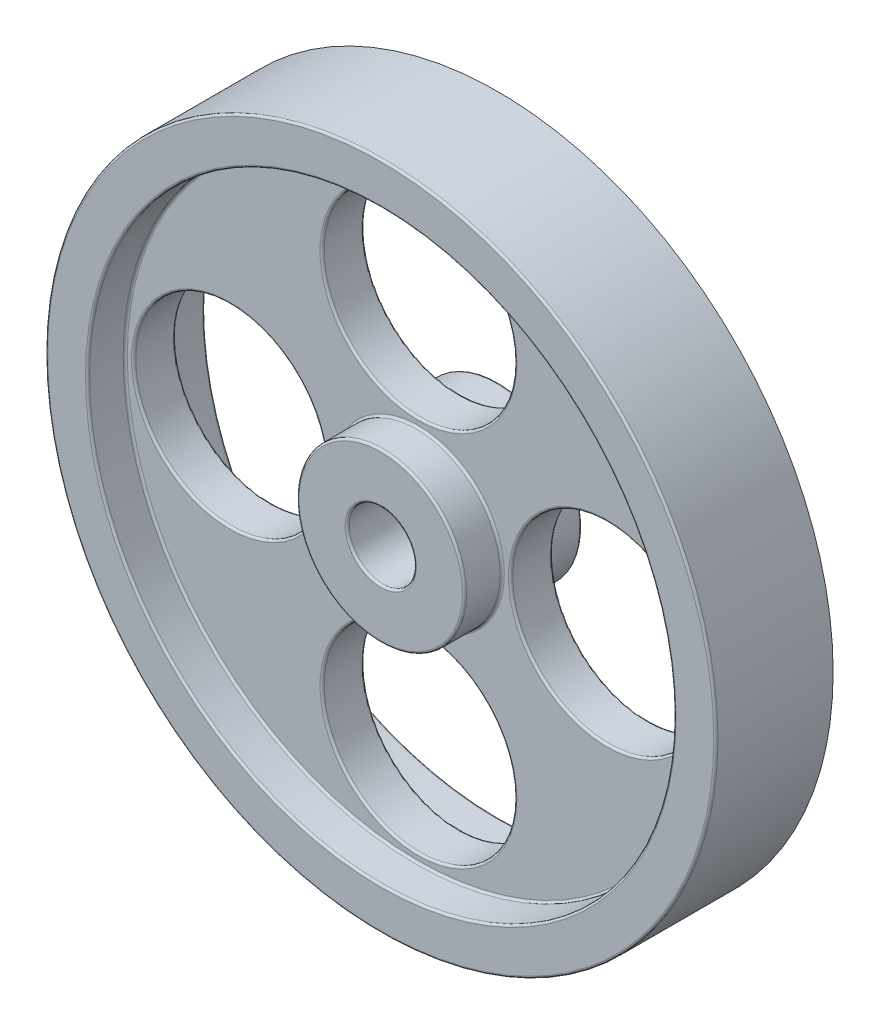
ISO-10303-21;
HEADER;
FILE_DESCRIPTION(('STEP AP214'),'2;1');
FILE_NAME('part.step','',(''),(''),'','','');
FILE_SCHEMA(('AUTOMOTIVE_DESIGN { 1 0 10303 214 1 1 1 1 }'));
ENDSEC;
DATA;
#1=APPLICATION_CONTEXT('core data for automotive mechanical design processes');
#2=APPLICATION_PROTOCOL_DEFINITION('international standard','automotive_design',2000,#1);
#3=PRODUCT_CONTEXT('',#1,'mechanical');
#4=PRODUCT('Part','Part','',(#3));
#5=PRODUCT_RELATED_PRODUCT_CATEGORY('part','',(#4));
#6=PRODUCT_DEFINITION_FORMATION('','',#4);
#7=PRODUCT_DEFINITION_CONTEXT('part definition',#1,'design');
#8=PRODUCT_DEFINITION('design','',#6,#7);
#9=PRODUCT_DEFINITION_SHAPE('','',#8);
#10=(LENGTH_UNIT() NAMED_UNIT(*) SI_UNIT(.MILLI.,.METRE.));
#11=(NAMED_UNIT(*) PLANE_ANGLE_UNIT() SI_UNIT($,.RADIAN.));
#12=(NAMED_UNIT(*) SI_UNIT($,.STERADIAN.) SOLID_ANGLE_UNIT());
#13=UNCERTAINTY_MEASURE_WITH_UNIT(LENGTH_MEASURE(1.E-05),#10,'distance_accuracy_value','');
#14=(GEOMETRIC_REPRESENTATION_CONTEXT(3) GLOBAL_UNCERTAINTY_ASSIGNED_CONTEXT((#13)) GLOBAL_UNIT_ASSIGNED_CONTEXT((#10,
#11,#12)) REPRESENTATION_CONTEXT('',''));
#15=CARTESIAN_POINT('',(0.,0.,0.));
#16=DIRECTION('',(0.,0.,1.));
#17=DIRECTION('',(1.,0.,0.));
#18=AXIS2_PLACEMENT_3D('',#15,#16,#17);
#19=CARTESIAN_POINT('',(0.,0.,177.8));
#20=DIRECTION('',(0.,0.,-1.));
#21=DIRECTION('',(-1.,0.,0.));
#22=AXIS2_PLACEMENT_3D('',#19,#20,#21);
#23=CYLINDRICAL_SURFACE('',#22,101.6);
#24=CARTESIAN_POINT('',(0.,0.,-171.45));
#25=DIRECTION('',(0.,0.,-1.));
#26=DIRECTION('',(-1.,0.,0.));
#27=AXIS2_PLACEMENT_3D('',#24,#25,#26);
#28=CIRCLE('',#27,101.6);
#29=CARTESIAN_POINT('',(-101.6,0.,-171.45));
#30=VERTEX_POINT('',#29);
#31=EDGE_CURVE('E83',#30,#30,#28,.T.);
#32=ORIENTED_EDGE('',*,*,#31,.T.);
#33=EDGE_LOOP('',(#32));
#34=FACE_BOUND('',#33,.T.);
#35=CARTESIAN_POINT('',(0.,0.,171.45));
#36=DIRECTION('',(0.,0.,1.));
#37=DIRECTION('',(1.,0.,0.));
#38=AXIS2_PLACEMENT_3D('',#35,#36,#37);
#39=CIRCLE('',#38,101.6);
#40=CARTESIAN_POINT('',(101.6,0.,171.45));
#41=VERTEX_POINT('',#40);
#42=EDGE_CURVE('E86',#41,#41,#39,.T.);
#43=ORIENTED_EDGE('',*,*,#42,.T.);
#44=EDGE_LOOP('',(#43));
#45=FACE_BOUND('',#44,.T.);
#46=ADVANCED_FACE('F30',(#34,#45),#23,.F.);
#47=CARTESIAN_POINT('',(0.,0.,-177.8));
#48=DIRECTION('',(0.,0.,1.));
#49=DIRECTION('',(1.,0.,0.));
#50=AXIS2_PLACEMENT_3D('',#47,#48,#49);
#51=PLANE('',#50);
#52=CARTESIAN_POINT('',(0.,0.,-177.8));
#53=DIRECTION('',(0.,0.,1.));
#54=DIRECTION('',(1.,0.,0.));
#55=AXIS2_PLACEMENT_3D('',#52,#53,#54);
#56=CIRCLE('',#55,895.35);
#57=CARTESIAN_POINT('',(895.35,0.,-177.8));
#58=VERTEX_POINT('',#57);
#59=EDGE_CURVE('E149',#58,#58,#56,.T.);
#60=ORIENTED_EDGE('',*,*,#59,.T.);
#61=EDGE_LOOP('',(#60));
#62=FACE_BOUND('',#61,.T.);
#63=CARTESIAN_POINT('',(0.,0.,-177.8));
#64=DIRECTION('',(0.,0.,1.));
#65=DIRECTION('',(1.,0.,0.));
#66=AXIS2_PLACEMENT_3D('',#63,#64,#65);
#67=CIRCLE('',#66,1016.);
#68=CARTESIAN_POINT('',(1016.,0.,-177.8));
#69=VERTEX_POINT('',#68);
#70=EDGE_CURVE('E152',#69,#69,#67,.T.);
#71=ORIENTED_EDGE('',*,*,#70,.F.);
#72=EDGE_LOOP('',(#71));
#73=FACE_BOUND('',#72,.T.);
#74=ADVANCED_FACE('F158',(#62,#73),#51,.F.);
#75=CARTESIAN_POINT('',(0.,571.5,-177.8));
#76=DIRECTION('',(0.,0.,1.));
#77=DIRECTION('',(1.,0.,0.));
#78=AXIS2_PLACEMENT_3D('',#75,#76,#77);
#79=CYLINDRICAL_SURFACE('',#78,292.1);
#80=CARTESIAN_POINT('',(0.,571.5,-57.15));
#81=DIRECTION('',(0.,0.,-1.));
#82=DIRECTION('',(-1.,0.,0.));
#83=AXIS2_PLACEMENT_3D('',#80,#81,#82);
#84=CIRCLE('',#83,292.1);
#85=CARTESIAN_POINT('',(-292.1,571.5,-57.15));
#86=VERTEX_POINT('',#85);
#87=EDGE_CURVE('E119',#86,#86,#84,.T.);
#88=ORIENTED_EDGE('',*,*,#87,.T.);
#89=EDGE_LOOP('',(#88));
#90=FACE_BOUND('',#89,.T.);
#91=CARTESIAN_POINT('',(0.,571.5,57.15));
#92=DIRECTION('',(0.,0.,1.));
#93=DIRECTION('',(1.,0.,0.));
#94=AXIS2_PLACEMENT_3D('',#91,#92,#93);
#95=CIRCLE('',#94,292.1);
#96=CARTESIAN_POINT('',(292.1,571.5,57.15));
#97=VERTEX_POINT('',#96);
#98=EDGE_CURVE('E122',#97,#97,#95,.T.);
#99=ORIENTED_EDGE('',*,*,#98,.T.);
#100=EDGE_LOOP('',(#99));
#101=FACE_BOUND('',#100,.T.);
#102=ADVANCED_FACE('F160',(#90,#101),#79,.F.);
#103=CARTESIAN_POINT('',(-571.499999999984,-1.62080126571903E-11,-177.8));
#104=DIRECTION('',(0.,0.,1.));
#105=DIRECTION('',(1.,0.,0.));
#106=AXIS2_PLACEMENT_3D('',#103,#104,#105);
#107=CYLINDRICAL_SURFACE('',#106,292.100000000026);
#108=CARTESIAN_POINT('',(-571.499999999984,-1.62080126571903E-11,-57.15));
#109=DIRECTION('',(0.,0.,-1.));
#110=DIRECTION('',(-1.,0.,0.));
#111=AXIS2_PLACEMENT_3D('',#108,#109,#110);
#112=CIRCLE('',#111,292.100000000026);
#113=CARTESIAN_POINT('',(-863.60000000001,-1.62080126571903E-11,-57.15));
#114=VERTEX_POINT('',#113);
#115=EDGE_CURVE('E113',#114,#114,#112,.T.);
#116=ORIENTED_EDGE('',*,*,#115,.T.);
#117=EDGE_LOOP('',(#116));
#118=FACE_BOUND('',#117,.T.);
#119=CARTESIAN_POINT('',(-571.499999999984,-1.62080126571903E-11,57.15));
#120=DIRECTION('',(0.,0.,1.));
#121=DIRECTION('',(1.,0.,0.));
#122=AXIS2_PLACEMENT_3D('',#119,#120,#121);
#123=CIRCLE('',#122,292.100000000026);
#124=CARTESIAN_POINT('',(-279.399999999958,-1.62080126571903E-11,57.15));
#125=VERTEX_POINT('',#124);
#126=EDGE_CURVE('E116',#125,#125,#123,.T.);
#127=ORIENTED_EDGE('',*,*,#126,.T.);
#128=EDGE_LOOP('',(#127));
#129=FACE_BOUND('',#128,.T.);
#130=ADVANCED_FACE('F167',(#118,#129),#107,.F.);
#131=CARTESIAN_POINT('',(571.500000000016,1.6138024092619E-11,-177.8));
#132=DIRECTION('',(0.,0.,1.));
#133=DIRECTION('',(1.,0.,0.));
#134=AXIS2_PLACEMENT_3D('',#131,#132,#133);
#135=CYLINDRICAL_SURFACE('',#134,292.100000000013);
#136=CARTESIAN_POINT('',(571.500000000016,1.6138024092619E-11,-57.15));
#137=DIRECTION('',(0.,0.,-1.));
#138=DIRECTION('',(-1.,0.,0.));
#139=AXIS2_PLACEMENT_3D('',#136,#137,#138);
#140=CIRCLE('',#139,292.100000000013);
#141=CARTESIAN_POINT('',(279.400000000004,1.6138024092619E-11,-57.15));
#142=VERTEX_POINT('',#141);
#143=EDGE_CURVE('E107',#142,#142,#140,.T.);
#144=ORIENTED_EDGE('',*,*,#143,.T.);
#145=EDGE_LOOP('',(#144));
#146=FACE_BOUND('',#145,.T.);
#147=CARTESIAN_POINT('',(571.500000000016,1.6138024092619E-11,57.15));
#148=DIRECTION('',(0.,0.,1.));
#149=DIRECTION('',(1.,0.,0.));
#150=AXIS2_PLACEMENT_3D('',#147,#148,#149);
#151=CIRCLE('',#150,292.100000000013);
#152=CARTESIAN_POINT('',(863.600000000029,1.6138024092619E-11,57.15));
#153=VERTEX_POINT('',#152);
#154=EDGE_CURVE('E110',#153,#153,#151,.T.);
#155=ORIENTED_EDGE('',*,*,#154,.T.);
#156=EDGE_LOOP('',(#155));
#157=FACE_BOUND('',#156,.T.);
#158=ADVANCED_FACE('F258',(#146,#157),#135,.F.);
#159=CARTESIAN_POINT('',(3.2276048185238E-11,-571.5,-177.8));
#160=DIRECTION('',(0.,0.,1.));
#161=DIRECTION('',(1.,0.,0.));
#162=AXIS2_PLACEMENT_3D('',#159,#160,#161);
#163=CYLINDRICAL_SURFACE('',#162,292.100000000035);
#164=CARTESIAN_POINT('',(3.2276048185238E-11,-571.5,-57.15));
#165=DIRECTION('',(0.,0.,-1.));
#166=DIRECTION('',(-1.,0.,0.));
#167=AXIS2_PLACEMENT_3D('',#164,#165,#166);
#168=CIRCLE('',#167,292.100000000035);
#169=CARTESIAN_POINT('',(-292.100000000002,-571.5,-57.15));
#170=VERTEX_POINT('',#169);
#171=EDGE_CURVE('E101',#170,#170,#168,.T.);
#172=ORIENTED_EDGE('',*,*,#171,.T.);
#173=EDGE_LOOP('',(#172));
#174=FACE_BOUND('',#173,.T.);
#175=CARTESIAN_POINT('',(3.2276048185238E-11,-571.5,57.15));
#176=DIRECTION('',(0.,0.,1.));
#177=DIRECTION('',(1.,0.,0.));
#178=AXIS2_PLACEMENT_3D('',#175,#176,#177);
#179=CIRCLE('',#178,292.100000000035);
#180=CARTESIAN_POINT('',(292.100000000067,-571.5,57.15));
#181=VERTEX_POINT('',#180);
#182=EDGE_CURVE('E104',#181,#181,#179,.T.);
#183=ORIENTED_EDGE('',*,*,#182,.T.);
#184=EDGE_LOOP('',(#183));
#185=FACE_BOUND('',#184,.T.);
#186=ADVANCED_FACE('F260',(#174,#185),#163,.F.);
#187=CARTESIAN_POINT('',(0.,0.,63.5));
#188=DIRECTION('',(0.,0.,1.));
#189=DIRECTION('',(1.,0.,0.));
#190=AXIS2_PLACEMENT_3D('',#187,#188,#189);
#191=PLANE('',#190);
#192=CARTESIAN_POINT('',(0.,0.,63.5));
#193=DIRECTION('',(0.,0.,1.));
#194=DIRECTION('',(1.,0.,0.));
#195=AXIS2_PLACEMENT_3D('',#192,#193,#194);
#196=CIRCLE('',#195,260.35);
#197=CARTESIAN_POINT('',(260.35,0.,63.5));
#198=VERTEX_POINT('',#197);
#199=EDGE_CURVE('E10',#198,#198,#196,.F.);
#200=ORIENTED_EDGE('',*,*,#199,.T.);
#201=EDGE_LOOP('',(#200));
#202=FACE_BOUND('',#201,.T.);
#203=CARTESIAN_POINT('',(0.,0.,63.5));
#204=DIRECTION('',(0.,0.,1.));
#205=DIRECTION('',(1.,0.,0.));
#206=AXIS2_PLACEMENT_3D('',#203,#204,#205);
#207=CIRCLE('',#206,882.65);
#208=CARTESIAN_POINT('',(882.65,0.,63.5));
#209=VERTEX_POINT('',#208);
#210=EDGE_CURVE('E37',#209,#209,#207,.T.);
#211=ORIENTED_EDGE('',*,*,#210,.T.);
#212=EDGE_LOOP('',(#211));
#213=FACE_BOUND('',#212,.T.);
#214=CARTESIAN_POINT('',(0.,571.5,63.5));
#215=DIRECTION('',(0.,0.,1.));
#216=DIRECTION('',(1.,0.,0.));
#217=AXIS2_PLACEMENT_3D('',#214,#215,#216);
#218=CIRCLE('',#217,298.45);
#219=CARTESIAN_POINT('',(298.45,571.5,63.5));
#220=VERTEX_POINT('',#219);
#221=EDGE_CURVE('E41',#220,#220,#218,.F.);
#222=ORIENTED_EDGE('',*,*,#221,.T.);
#223=EDGE_LOOP('',(#222));
#224=FACE_BOUND('',#223,.T.);
#225=CARTESIAN_POINT('',(-571.499999999984,-1.62080126571903E-11,63.5));
#226=DIRECTION('',(0.,0.,1.));
#227=DIRECTION('',(1.,0.,0.));
#228=AXIS2_PLACEMENT_3D('',#225,#226,#227);
#229=CIRCLE('',#228,298.450000000026);
#230=CARTESIAN_POINT('',(-273.049999999958,-1.62080126571903E-11,63.5));
#231=VERTEX_POINT('',#230);
#232=EDGE_CURVE('E45',#231,#231,#229,.F.);
#233=ORIENTED_EDGE('',*,*,#232,.T.);
#234=EDGE_LOOP('',(#233));
#235=FACE_BOUND('',#234,.T.);
#236=CARTESIAN_POINT('',(571.500000000016,1.6138024092619E-11,63.5));
#237=DIRECTION('',(0.,0.,1.));
#238=DIRECTION('',(1.,0.,0.));
#239=AXIS2_PLACEMENT_3D('',#236,#237,#238);
#240=CIRCLE('',#239,298.450000000013);
#241=CARTESIAN_POINT('',(869.950000000029,1.6138024092619E-11,63.5));
#242=VERTEX_POINT('',#241);
#243=EDGE_CURVE('E50',#242,#242,#240,.F.);
#244=ORIENTED_EDGE('',*,*,#243,.T.);
#245=EDGE_LOOP('',(#244));
#246=FACE_BOUND('',#245,.T.);
#247=CARTESIAN_POINT('',(3.2276048185238E-11,-571.5,63.5));
#248=DIRECTION('',(0.,0.,1.));
#249=DIRECTION('',(1.,0.,0.));
#250=AXIS2_PLACEMENT_3D('',#247,#248,#249);
#251=CIRCLE('',#250,298.450000000035);
#252=CARTESIAN_POINT('',(298.450000000067,-571.5,63.5));
#253=VERTEX_POINT('',#252);
#254=EDGE_CURVE('E53',#253,#253,#251,.F.);
#255=ORIENTED_EDGE('',*,*,#254,.T.);
#256=EDGE_LOOP('',(#255));
#257=FACE_BOUND('',#256,.T.);
#258=ADVANCED_FACE('F267',(#202,#213,#224,#235,#246,#257),#191,.T.);
#259=CARTESIAN_POINT('',(0.,0.,177.8));
#260=DIRECTION('',(0.,0.,1.));
#261=DIRECTION('',(1.,0.,0.));
#262=AXIS2_PLACEMENT_3D('',#259,#260,#261);
#263=PLANE('',#262);
#264=CARTESIAN_POINT('',(0.,0.,177.8));
#265=DIRECTION('',(0.,0.,1.));
#266=DIRECTION('',(1.,0.,0.));
#267=AXIS2_PLACEMENT_3D('',#264,#265,#266);
#268=CIRCLE('',#267,1009.65);
#269=CARTESIAN_POINT('',(1009.65,0.,177.8));
#270=VERTEX_POINT('',#269);
#271=EDGE_CURVE('E65',#270,#270,#268,.T.);
#272=ORIENTED_EDGE('',*,*,#271,.T.);
#273=EDGE_LOOP('',(#272));
#274=FACE_BOUND('',#273,.T.);
#275=CARTESIAN_POINT('',(0.,0.,177.8));
#276=DIRECTION('',(0.,0.,1.));
#277=DIRECTION('',(1.,0.,0.));
#278=AXIS2_PLACEMENT_3D('',#275,#276,#277);
#279=CIRCLE('',#278,895.35);
#280=CARTESIAN_POINT('',(895.35,0.,177.8));
#281=VERTEX_POINT('',#280);
#282=EDGE_CURVE('E68',#281,#281,#279,.F.);
#283=ORIENTED_EDGE('',*,*,#282,.T.);
#284=EDGE_LOOP('',(#283));
#285=FACE_BOUND('',#284,.T.);
#286=ADVANCED_FACE('F174',(#274,#285),#263,.T.);
#287=CARTESIAN_POINT('',(0.,0.,177.8));
#288=DIRECTION('',(0.,0.,-1.));
#289=DIRECTION('',(-1.,0.,0.));
#290=AXIS2_PLACEMENT_3D('',#287,#288,#289);
#291=CYLINDRICAL_SURFACE('',#290,1016.);
#292=CARTESIAN_POINT('',(0.,0.,171.45));
#293=DIRECTION('',(0.,0.,1.));
#294=DIRECTION('',(1.,0.,0.));
#295=AXIS2_PLACEMENT_3D('',#292,#293,#294);
#296=CIRCLE('',#295,1016.);
#297=CARTESIAN_POINT('',(1016.,0.,171.45));
#298=VERTEX_POINT('',#297);
#299=EDGE_CURVE('E62',#298,#298,#296,.F.);
#300=ORIENTED_EDGE('',*,*,#299,.T.);
#301=EDGE_LOOP('',(#300));
#302=FACE_BOUND('',#301,.T.);
#303=ORIENTED_EDGE('',*,*,#70,.T.);
#304=EDGE_LOOP('',(#303));
#305=FACE_BOUND('',#304,.T.);
#306=ADVANCED_FACE('F156',(#302,#305),#291,.T.);
#307=CARTESIAN_POINT('',(0.,0.,63.5));
#308=DIRECTION('',(0.,0.,1.));
#309=DIRECTION('',(1.,0.,0.));
#310=AXIS2_PLACEMENT_3D('',#307,#308,#309);
#311=CYLINDRICAL_SURFACE('',#310,889.);
#312=CARTESIAN_POINT('',(0.,0.,171.45));
#313=DIRECTION('',(0.,0.,1.));
#314=DIRECTION('',(1.,0.,0.));
#315=AXIS2_PLACEMENT_3D('',#312,#313,#314);
#316=CIRCLE('',#315,889.);
#317=CARTESIAN_POINT('',(889.,0.,171.45));
#318=VERTEX_POINT('',#317);
#319=EDGE_CURVE('E56',#318,#318,#316,.T.);
#320=ORIENTED_EDGE('',*,*,#319,.T.);
#321=EDGE_LOOP('',(#320));
#322=FACE_BOUND('',#321,.T.);
#323=CARTESIAN_POINT('',(0.,0.,69.85));
#324=DIRECTION('',(0.,0.,1.));
#325=DIRECTION('',(1.,0.,0.));
#326=AXIS2_PLACEMENT_3D('',#323,#324,#325);
#327=CIRCLE('',#326,889.);
#328=CARTESIAN_POINT('',(889.,0.,69.85));
#329=VERTEX_POINT('',#328);
#330=EDGE_CURVE('E59',#329,#329,#327,.F.);
#331=ORIENTED_EDGE('',*,*,#330,.T.);
#332=EDGE_LOOP('',(#331));
#333=FACE_BOUND('',#332,.T.);
#334=ADVANCED_FACE('F177',(#322,#333),#311,.F.);
#335=CARTESIAN_POINT('',(0.,0.,177.8));
#336=DIRECTION('',(0.,0.,1.));
#337=DIRECTION('',(1.,0.,0.));
#338=AXIS2_PLACEMENT_3D('',#335,#336,#337);
#339=PLANE('',#338);
#340=CARTESIAN_POINT('',(0.,0.,177.8));
#341=DIRECTION('',(0.,0.,1.));
#342=DIRECTION('',(1.,0.,0.));
#343=AXIS2_PLACEMENT_3D('',#340,#341,#342);
#344=CIRCLE('',#343,107.95);
#345=CARTESIAN_POINT('',(107.95,0.,177.8));
#346=VERTEX_POINT('',#345);
#347=EDGE_CURVE('E77',#346,#346,#344,.F.);
#348=ORIENTED_EDGE('',*,*,#347,.T.);
#349=EDGE_LOOP('',(#348));
#350=FACE_BOUND('',#349,.T.);
#351=CARTESIAN_POINT('',(0.,0.,177.8));
#352=DIRECTION('',(0.,0.,1.));
#353=DIRECTION('',(1.,0.,0.));
#354=AXIS2_PLACEMENT_3D('',#351,#352,#353);
#355=CIRCLE('',#354,247.65);
#356=CARTESIAN_POINT('',(247.65,0.,177.8));
#357=VERTEX_POINT('',#356);
#358=EDGE_CURVE('E80',#357,#357,#355,.T.);
#359=ORIENTED_EDGE('',*,*,#358,.T.);
#360=EDGE_LOOP('',(#359));
#361=FACE_BOUND('',#360,.T.);
#362=ADVANCED_FACE('F273',(#350,#361),#339,.T.);
#363=CARTESIAN_POINT('',(0.,0.,177.8));
#364=DIRECTION('',(0.,0.,-1.));
#365=DIRECTION('',(-1.,0.,0.));
#366=AXIS2_PLACEMENT_3D('',#363,#364,#365);
#367=CYLINDRICAL_SURFACE('',#366,254.);
#368=CARTESIAN_POINT('',(0.,0.,171.45));
#369=DIRECTION('',(0.,0.,1.));
#370=DIRECTION('',(1.,0.,0.));
#371=AXIS2_PLACEMENT_3D('',#368,#369,#370);
#372=CIRCLE('',#371,254.);
#373=CARTESIAN_POINT('',(254.,0.,171.45));
#374=VERTEX_POINT('',#373);
#375=EDGE_CURVE('E71',#374,#374,#372,.F.);
#376=ORIENTED_EDGE('',*,*,#375,.T.);
#377=EDGE_LOOP('',(#376));
#378=FACE_BOUND('',#377,.T.);
#379=CARTESIAN_POINT('',(0.,0.,69.85));
#380=DIRECTION('',(0.,0.,1.));
#381=DIRECTION('',(1.,0.,0.));
#382=AXIS2_PLACEMENT_3D('',#379,#380,#381);
#383=CIRCLE('',#382,254.);
#384=CARTESIAN_POINT('',(254.,0.,69.85));
#385=VERTEX_POINT('',#384);
#386=EDGE_CURVE('E74',#385,#385,#383,.T.);
#387=ORIENTED_EDGE('',*,*,#386,.T.);
#388=EDGE_LOOP('',(#387));
#389=FACE_BOUND('',#388,.T.);
#390=ADVANCED_FACE('F276',(#378,#389),#367,.T.);
#391=CARTESIAN_POINT('',(0.,0.,-63.5));
#392=DIRECTION('',(0.,0.,-1.));
#393=DIRECTION('',(1.,0.,0.));
#394=AXIS2_PLACEMENT_3D('',#391,#392,#393);
#395=PLANE('',#394);
#396=CARTESIAN_POINT('',(0.,571.5,-63.5));
#397=DIRECTION('',(0.,0.,-1.));
#398=DIRECTION('',(-1.,0.,0.));
#399=AXIS2_PLACEMENT_3D('',#396,#397,#398);
#400=CIRCLE('',#399,298.45);
#401=CARTESIAN_POINT('',(-298.45,571.5,-63.5));
#402=VERTEX_POINT('',#401);
#403=EDGE_CURVE('E125',#402,#402,#400,.F.);
#404=ORIENTED_EDGE('',*,*,#403,.T.);
#405=EDGE_LOOP('',(#404));
#406=FACE_BOUND('',#405,.T.);
#407=CARTESIAN_POINT('',(-571.499999999984,-1.62080126571903E-11,-63.5));
#408=DIRECTION('',(0.,0.,-1.));
#409=DIRECTION('',(-1.,0.,0.));
#410=AXIS2_PLACEMENT_3D('',#407,#408,#409);
#411=CIRCLE('',#410,298.450000000026);
#412=CARTESIAN_POINT('',(-869.95000000001,-1.62080126571903E-11,-63.5));
#413=VERTEX_POINT('',#412);
#414=EDGE_CURVE('E128',#413,#413,#411,.F.);
#415=ORIENTED_EDGE('',*,*,#414,.T.);
#416=EDGE_LOOP('',(#415));
#417=FACE_BOUND('',#416,.T.);
#418=CARTESIAN_POINT('',(571.500000000016,1.6138024092619E-11,-63.5));
#419=DIRECTION('',(0.,0.,-1.));
#420=DIRECTION('',(-1.,0.,0.));
#421=AXIS2_PLACEMENT_3D('',#418,#419,#420);
#422=CIRCLE('',#421,298.450000000013);
#423=CARTESIAN_POINT('',(273.050000000004,1.6138024092619E-11,-63.5));
#424=VERTEX_POINT('',#423);
#425=EDGE_CURVE('E131',#424,#424,#422,.F.);
#426=ORIENTED_EDGE('',*,*,#425,.T.);
#427=EDGE_LOOP('',(#426));
#428=FACE_BOUND('',#427,.T.);
#429=CARTESIAN_POINT('',(3.2276048185238E-11,-571.5,-63.5));
#430=DIRECTION('',(0.,0.,-1.));
#431=DIRECTION('',(-1.,0.,0.));
#432=AXIS2_PLACEMENT_3D('',#429,#430,#431);
#433=CIRCLE('',#432,298.450000000035);
#434=CARTESIAN_POINT('',(-298.450000000002,-571.5,-63.5));
#435=VERTEX_POINT('',#434);
#436=EDGE_CURVE('E134',#435,#435,#433,.F.);
#437=ORIENTED_EDGE('',*,*,#436,.T.);
#438=EDGE_LOOP('',(#437));
#439=FACE_BOUND('',#438,.T.);
#440=CARTESIAN_POINT('',(0.,0.,-63.5));
#441=DIRECTION('',(0.,0.,-1.));
#442=DIRECTION('',(-1.,0.,0.));
#443=AXIS2_PLACEMENT_3D('',#440,#441,#442);
#444=CIRCLE('',#443,882.65);
#445=CARTESIAN_POINT('',(-882.65,0.,-63.5));
#446=VERTEX_POINT('',#445);
#447=EDGE_CURVE('E137',#446,#446,#444,.T.);
#448=ORIENTED_EDGE('',*,*,#447,.T.);
#449=EDGE_LOOP('',(#448));
#450=FACE_BOUND('',#449,.T.);
#451=CARTESIAN_POINT('',(0.,0.,-63.5));
#452=DIRECTION('',(0.,0.,-1.));
#453=DIRECTION('',(-1.,0.,0.));
#454=AXIS2_PLACEMENT_3D('',#451,#452,#453);
#455=CIRCLE('',#454,260.35);
#456=CARTESIAN_POINT('',(-260.35,0.,-63.5));
#457=VERTEX_POINT('',#456);
#458=EDGE_CURVE('E140',#457,#457,#455,.F.);
#459=ORIENTED_EDGE('',*,*,#458,.T.);
#460=EDGE_LOOP('',(#459));
#461=FACE_BOUND('',#460,.T.);
#462=ADVANCED_FACE('F280',(#406,#417,#428,#439,#450,#461),#395,.T.);
#463=CARTESIAN_POINT('',(0.,0.,-63.5));
#464=DIRECTION('',(0.,0.,-1.));
#465=DIRECTION('',(-1.,0.,0.));
#466=AXIS2_PLACEMENT_3D('',#463,#464,#465);
#467=CYLINDRICAL_SURFACE('',#466,889.);
#468=CARTESIAN_POINT('',(0.,0.,-171.45));
#469=DIRECTION('',(0.,0.,1.));
#470=DIRECTION('',(1.,0.,0.));
#471=AXIS2_PLACEMENT_3D('',#468,#469,#470);
#472=CIRCLE('',#471,889.);
#473=CARTESIAN_POINT('',(889.,0.,-171.45));
#474=VERTEX_POINT('',#473);
#475=EDGE_CURVE('E143',#474,#474,#472,.F.);
#476=ORIENTED_EDGE('',*,*,#475,.T.);
#477=EDGE_LOOP('',(#476));
#478=FACE_BOUND('',#477,.T.);
#479=CARTESIAN_POINT('',(0.,0.,-69.85));
#480=DIRECTION('',(0.,0.,-1.));
#481=DIRECTION('',(-1.,0.,0.));
#482=AXIS2_PLACEMENT_3D('',#479,#480,#481);
#483=CIRCLE('',#482,889.);
#484=CARTESIAN_POINT('',(-889.,0.,-69.85));
#485=VERTEX_POINT('',#484);
#486=EDGE_CURVE('E146',#485,#485,#483,.F.);
#487=ORIENTED_EDGE('',*,*,#486,.T.);
#488=EDGE_LOOP('',(#487));
#489=FACE_BOUND('',#488,.T.);
#490=ADVANCED_FACE('F310',(#478,#489),#467,.F.);
#491=CARTESIAN_POINT('',(0.,0.,-177.8));
#492=DIRECTION('',(0.,0.,1.));
#493=DIRECTION('',(1.,0.,0.));
#494=AXIS2_PLACEMENT_3D('',#491,#492,#493);
#495=CYLINDRICAL_SURFACE('',#494,254.);
#496=CARTESIAN_POINT('',(0.,0.,-69.85));
#497=DIRECTION('',(0.,0.,-1.));
#498=DIRECTION('',(-1.,0.,0.));
#499=AXIS2_PLACEMENT_3D('',#496,#497,#498);
#500=CIRCLE('',#499,254.);
#501=CARTESIAN_POINT('',(-254.,0.,-69.85));
#502=VERTEX_POINT('',#501);
#503=EDGE_CURVE('E95',#502,#502,#500,.T.);
#504=ORIENTED_EDGE('',*,*,#503,.T.);
#505=EDGE_LOOP('',(#504));
#506=FACE_BOUND('',#505,.T.);
#507=CARTESIAN_POINT('',(0.,0.,-171.45));
#508=DIRECTION('',(0.,0.,-1.));
#509=DIRECTION('',(-1.,0.,0.));
#510=AXIS2_PLACEMENT_3D('',#507,#508,#509);
#511=CIRCLE('',#510,254.);
#512=CARTESIAN_POINT('',(-254.,0.,-171.45));
#513=VERTEX_POINT('',#512);
#514=EDGE_CURVE('E98',#513,#513,#511,.F.);
#515=ORIENTED_EDGE('',*,*,#514,.T.);
#516=EDGE_LOOP('',(#515));
#517=FACE_BOUND('',#516,.T.);
#518=ADVANCED_FACE('F318',(#506,#517),#495,.T.);
#519=CARTESIAN_POINT('',(0.,0.,-177.8));
#520=DIRECTION('',(0.,0.,-1.));
#521=DIRECTION('',(1.,0.,0.));
#522=AXIS2_PLACEMENT_3D('',#519,#520,#521);
#523=PLANE('',#522);
#524=CARTESIAN_POINT('',(0.,0.,-177.8));
#525=DIRECTION('',(0.,0.,-1.));
#526=DIRECTION('',(-1.,0.,0.));
#527=AXIS2_PLACEMENT_3D('',#524,#525,#526);
#528=CIRCLE('',#527,247.65);
#529=CARTESIAN_POINT('',(-247.65,0.,-177.8));
#530=VERTEX_POINT('',#529);
#531=EDGE_CURVE('E89',#530,#530,#528,.T.);
#532=ORIENTED_EDGE('',*,*,#531,.T.);
#533=EDGE_LOOP('',(#532));
#534=FACE_BOUND('',#533,.T.);
#535=CARTESIAN_POINT('',(0.,0.,-177.8));
#536=DIRECTION('',(0.,0.,-1.));
#537=DIRECTION('',(-1.,0.,0.));
#538=AXIS2_PLACEMENT_3D('',#535,#536,#537);
#539=CIRCLE('',#538,107.95);
#540=CARTESIAN_POINT('',(-107.95,0.,-177.8));
#541=VERTEX_POINT('',#540);
#542=EDGE_CURVE('E92',#541,#541,#539,.F.);
#543=ORIENTED_EDGE('',*,*,#542,.T.);
#544=EDGE_LOOP('',(#543));
#545=FACE_BOUND('',#544,.T.);
#546=ADVANCED_FACE('F183',(#534,#545),#523,.T.);
#547=CARTESIAN_POINT('',(0.,0.,-171.45));
#548=DIRECTION('',(0.,0.,1.));
#549=DIRECTION('',(1.,0.,0.));
#550=AXIS2_PLACEMENT_3D('',#547,#548,#549);
#551=TOROIDAL_SURFACE('',#550,895.35,6.35);
#552=ORIENTED_EDGE('',*,*,#475,.F.);
#553=EDGE_LOOP('',(#552));
#554=FACE_BOUND('',#553,.T.);
#555=ORIENTED_EDGE('',*,*,#59,.F.);
#556=EDGE_LOOP('',(#555));
#557=FACE_BOUND('',#556,.T.);
#558=ADVANCED_FACE('F179',(#554,#557),#551,.T.);
#559=CARTESIAN_POINT('',(0.,571.5,-57.15));
#560=DIRECTION('',(0.,0.,-1.));
#561=DIRECTION('',(-1.,0.,0.));
#562=AXIS2_PLACEMENT_3D('',#559,#560,#561);
#563=TOROIDAL_SURFACE('',#562,298.45,6.35);
#564=ORIENTED_EDGE('',*,*,#87,.F.);
#565=EDGE_LOOP('',(#564));
#566=FACE_BOUND('',#565,.T.);
#567=ORIENTED_EDGE('',*,*,#403,.F.);
#568=EDGE_LOOP('',(#567));
#569=FACE_BOUND('',#568,.T.);
#570=ADVANCED_FACE('F182',(#566,#569),#563,.T.);
#571=CARTESIAN_POINT('',(-571.499999999984,-1.62080126571903E-11,-57.15));
#572=DIRECTION('',(0.,0.,-1.));
#573=DIRECTION('',(-1.,0.,0.));
#574=AXIS2_PLACEMENT_3D('',#571,#572,#573);
#575=TOROIDAL_SURFACE('',#574,298.450000000026,6.35);
#576=ORIENTED_EDGE('',*,*,#115,.F.);
#577=EDGE_LOOP('',(#576));
#578=FACE_BOUND('',#577,.T.);
#579=ORIENTED_EDGE('',*,*,#414,.F.);
#580=EDGE_LOOP('',(#579));
#581=FACE_BOUND('',#580,.T.);
#582=ADVANCED_FACE('F187',(#578,#581),#575,.T.);
#583=CARTESIAN_POINT('',(571.500000000016,1.6138024092619E-11,-57.15));
#584=DIRECTION('',(0.,0.,-1.));
#585=DIRECTION('',(-1.,0.,0.));
#586=AXIS2_PLACEMENT_3D('',#583,#584,#585);
#587=TOROIDAL_SURFACE('',#586,298.450000000013,6.35);
#588=ORIENTED_EDGE('',*,*,#143,.F.);
#589=EDGE_LOOP('',(#588));
#590=FACE_BOUND('',#589,.T.);
#591=ORIENTED_EDGE('',*,*,#425,.F.);
#592=EDGE_LOOP('',(#591));
#593=FACE_BOUND('',#592,.T.);
#594=ADVANCED_FACE('F191',(#590,#593),#587,.T.);
#595=CARTESIAN_POINT('',(3.2276048185238E-11,-571.5,-57.15));
#596=DIRECTION('',(0.,0.,-1.));
#597=DIRECTION('',(-1.,0.,0.));
#598=AXIS2_PLACEMENT_3D('',#595,#596,#597);
#599=TOROIDAL_SURFACE('',#598,298.450000000035,6.35);
#600=ORIENTED_EDGE('',*,*,#171,.F.);
#601=EDGE_LOOP('',(#600));
#602=FACE_BOUND('',#601,.T.);
#603=ORIENTED_EDGE('',*,*,#436,.F.);
#604=EDGE_LOOP('',(#603));
#605=FACE_BOUND('',#604,.T.);
#606=ADVANCED_FACE('F195',(#602,#605),#599,.T.);
#607=CARTESIAN_POINT('',(0.,0.,-69.85));
#608=DIRECTION('',(0.,0.,-1.));
#609=DIRECTION('',(-1.,0.,0.));
#610=AXIS2_PLACEMENT_3D('',#607,#608,#609);
#611=TOROIDAL_SURFACE('',#610,882.65,6.35);
#612=ORIENTED_EDGE('',*,*,#447,.F.);
#613=EDGE_LOOP('',(#612));
#614=FACE_BOUND('',#613,.T.);
#615=ORIENTED_EDGE('',*,*,#486,.F.);
#616=EDGE_LOOP('',(#615));
#617=FACE_BOUND('',#616,.T.);
#618=ADVANCED_FACE('F199',(#614,#617),#611,.F.);
#619=CARTESIAN_POINT('',(0.,0.,-69.85));
#620=DIRECTION('',(0.,0.,-1.));
#621=DIRECTION('',(-1.,0.,0.));
#622=AXIS2_PLACEMENT_3D('',#619,#620,#621);
#623=TOROIDAL_SURFACE('',#622,260.35,6.35);
#624=ORIENTED_EDGE('',*,*,#458,.F.);
#625=EDGE_LOOP('',(#624));
#626=FACE_BOUND('',#625,.T.);
#627=ORIENTED_EDGE('',*,*,#503,.F.);
#628=EDGE_LOOP('',(#627));
#629=FACE_BOUND('',#628,.T.);
#630=ADVANCED_FACE('F203',(#626,#629),#623,.F.);
#631=CARTESIAN_POINT('',(0.,0.,-171.45));
#632=DIRECTION('',(0.,0.,-1.));
#633=DIRECTION('',(-1.,0.,0.));
#634=AXIS2_PLACEMENT_3D('',#631,#632,#633);
#635=TOROIDAL_SURFACE('',#634,247.65,6.35);
#636=ORIENTED_EDGE('',*,*,#531,.F.);
#637=EDGE_LOOP('',(#636));
#638=FACE_BOUND('',#637,.T.);
#639=ORIENTED_EDGE('',*,*,#514,.F.);
#640=EDGE_LOOP('',(#639));
#641=FACE_BOUND('',#640,.T.);
#642=ADVANCED_FACE('F207',(#638,#641),#635,.T.);
#643=CARTESIAN_POINT('',(0.,0.,-171.45));
#644=DIRECTION('',(0.,0.,-1.));
#645=DIRECTION('',(-1.,0.,0.));
#646=AXIS2_PLACEMENT_3D('',#643,#644,#645);
#647=TOROIDAL_SURFACE('',#646,107.95,6.35);
#648=ORIENTED_EDGE('',*,*,#31,.F.);
#649=EDGE_LOOP('',(#648));
#650=FACE_BOUND('',#649,.T.);
#651=ORIENTED_EDGE('',*,*,#542,.F.);
#652=EDGE_LOOP('',(#651));
#653=FACE_BOUND('',#652,.T.);
#654=ADVANCED_FACE('F211',(#650,#653),#647,.T.);
#655=CARTESIAN_POINT('',(0.,0.,171.45));
#656=DIRECTION('',(0.,0.,1.));
#657=DIRECTION('',(1.,0.,0.));
#658=AXIS2_PLACEMENT_3D('',#655,#656,#657);
#659=TOROIDAL_SURFACE('',#658,107.95,6.35);
#660=ORIENTED_EDGE('',*,*,#347,.F.);
#661=EDGE_LOOP('',(#660));
#662=FACE_BOUND('',#661,.T.);
#663=ORIENTED_EDGE('',*,*,#42,.F.);
#664=EDGE_LOOP('',(#663));
#665=FACE_BOUND('',#664,.T.);
#666=ADVANCED_FACE('F215',(#662,#665),#659,.T.);
#667=CARTESIAN_POINT('',(0.,0.,171.45));
#668=DIRECTION('',(0.,0.,1.));
#669=DIRECTION('',(1.,0.,0.));
#670=AXIS2_PLACEMENT_3D('',#667,#668,#669);
#671=TOROIDAL_SURFACE('',#670,247.65,6.35);
#672=ORIENTED_EDGE('',*,*,#375,.F.);
#673=EDGE_LOOP('',(#672));
#674=FACE_BOUND('',#673,.T.);
#675=ORIENTED_EDGE('',*,*,#358,.F.);
#676=EDGE_LOOP('',(#675));
#677=FACE_BOUND('',#676,.T.);
#678=ADVANCED_FACE('F219',(#674,#677),#671,.T.);
#679=CARTESIAN_POINT('',(0.,0.,171.45));
#680=DIRECTION('',(0.,0.,1.));
#681=DIRECTION('',(1.,0.,0.));
#682=AXIS2_PLACEMENT_3D('',#679,#680,#681);
#683=TOROIDAL_SURFACE('',#682,1009.65,6.35);
#684=ORIENTED_EDGE('',*,*,#299,.F.);
#685=EDGE_LOOP('',(#684));
#686=FACE_BOUND('',#685,.T.);
#687=ORIENTED_EDGE('',*,*,#271,.F.);
#688=EDGE_LOOP('',(#687));
#689=FACE_BOUND('',#688,.T.);
#690=ADVANCED_FACE('F223',(#686,#689),#683,.T.);
#691=CARTESIAN_POINT('',(0.,0.,171.45));
#692=DIRECTION('',(0.,0.,1.));
#693=DIRECTION('',(1.,0.,0.));
#694=AXIS2_PLACEMENT_3D('',#691,#692,#693);
#695=TOROIDAL_SURFACE('',#694,895.35,6.35);
#696=ORIENTED_EDGE('',*,*,#282,.F.);
#697=EDGE_LOOP('',(#696));
#698=FACE_BOUND('',#697,.T.);
#699=ORIENTED_EDGE('',*,*,#319,.F.);
#700=EDGE_LOOP('',(#699));
#701=FACE_BOUND('',#700,.T.);
#702=ADVANCED_FACE('F227',(#698,#701),#695,.T.);
#703=CARTESIAN_POINT('',(0.,0.,69.85));
#704=DIRECTION('',(0.,0.,1.));
#705=DIRECTION('',(1.,0.,0.));
#706=AXIS2_PLACEMENT_3D('',#703,#704,#705);
#707=TOROIDAL_SURFACE('',#706,260.35,6.35);
#708=ORIENTED_EDGE('',*,*,#199,.F.);
#709=EDGE_LOOP('',(#708));
#710=FACE_BOUND('',#709,.T.);
#711=ORIENTED_EDGE('',*,*,#386,.F.);
#712=EDGE_LOOP('',(#711));
#713=FACE_BOUND('',#712,.T.);
#714=ADVANCED_FACE('F231',(#710,#713),#707,.F.);
#715=CARTESIAN_POINT('',(0.,0.,69.85));
#716=DIRECTION('',(0.,0.,1.));
#717=DIRECTION('',(1.,0.,0.));
#718=AXIS2_PLACEMENT_3D('',#715,#716,#717);
#719=TOROIDAL_SURFACE('',#718,882.65,6.35);
#720=ORIENTED_EDGE('',*,*,#330,.F.);
#721=EDGE_LOOP('',(#720));
#722=FACE_BOUND('',#721,.T.);
#723=ORIENTED_EDGE('',*,*,#210,.F.);
#724=EDGE_LOOP('',(#723));
#725=FACE_BOUND('',#724,.T.);
#726=ADVANCED_FACE('F235',(#722,#725),#719,.F.);
#727=CARTESIAN_POINT('',(0.,571.5,57.15));
#728=DIRECTION('',(0.,0.,1.));
#729=DIRECTION('',(1.,0.,0.));
#730=AXIS2_PLACEMENT_3D('',#727,#728,#729);
#731=TOROIDAL_SURFACE('',#730,298.45,6.35);
#732=ORIENTED_EDGE('',*,*,#221,.F.);
#733=EDGE_LOOP('',(#732));
#734=FACE_BOUND('',#733,.T.);
#735=ORIENTED_EDGE('',*,*,#98,.F.);
#736=EDGE_LOOP('',(#735));
#737=FACE_BOUND('',#736,.T.);
#738=ADVANCED_FACE('F239',(#734,#737),#731,.T.);
#739=CARTESIAN_POINT('',(-571.499999999984,-1.62080126571903E-11,57.15));
#740=DIRECTION('',(0.,0.,1.));
#741=DIRECTION('',(1.,0.,0.));
#742=AXIS2_PLACEMENT_3D('',#739,#740,#741);
#743=TOROIDAL_SURFACE('',#742,298.450000000026,6.35);
#744=ORIENTED_EDGE('',*,*,#232,.F.);
#745=EDGE_LOOP('',(#744));
#746=FACE_BOUND('',#745,.T.);
#747=ORIENTED_EDGE('',*,*,#126,.F.);
#748=EDGE_LOOP('',(#747));
#749=FACE_BOUND('',#748,.T.);
#750=ADVANCED_FACE('F243',(#746,#749),#743,.T.);
#751=CARTESIAN_POINT('',(571.500000000016,1.6138024092619E-11,57.15));
#752=DIRECTION('',(0.,0.,1.));
#753=DIRECTION('',(1.,0.,0.));
#754=AXIS2_PLACEMENT_3D('',#751,#752,#753);
#755=TOROIDAL_SURFACE('',#754,298.450000000013,6.35);
#756=ORIENTED_EDGE('',*,*,#243,.F.);
#757=EDGE_LOOP('',(#756));
#758=FACE_BOUND('',#757,.T.);
#759=ORIENTED_EDGE('',*,*,#154,.F.);
#760=EDGE_LOOP('',(#759));
#761=FACE_BOUND('',#760,.T.);
#762=ADVANCED_FACE('F246',(#758,#761),#755,.T.);
#763=CARTESIAN_POINT('',(3.2276048185238E-11,-571.5,57.15));
#764=DIRECTION('',(0.,0.,1.));
#765=DIRECTION('',(1.,0.,0.));
#766=AXIS2_PLACEMENT_3D('',#763,#764,#765);
#767=TOROIDAL_SURFACE('',#766,298.450000000035,6.35);
#768=ORIENTED_EDGE('',*,*,#254,.F.);
#769=EDGE_LOOP('',(#768));
#770=FACE_BOUND('',#769,.T.);
#771=ORIENTED_EDGE('',*,*,#182,.F.);
#772=EDGE_LOOP('',(#771));
#773=FACE_BOUND('',#772,.T.);
#774=ADVANCED_FACE('F32',(#770,#773),#767,.T.);
#775=CLOSED_SHELL('',(#46,#74,#102,#130,#158,#186,#258,#286,#306,#334,#362,#390,#462,#490,#518,
#546,#558,#570,#582,#594,#606,#618,#630,#642,#654,#666,#678,#690,#702,#714,#726,#738,#750,#762,#774));
#776=MANIFOLD_SOLID_BREP('B2',#775);
#777=ADVANCED_BREP_SHAPE_REPRESENTATION('',(#18,#776),#14);
#778=SHAPE_DEFINITION_REPRESENTATION(#9,#777);
ENDSEC;
END-ISO-10303-21;
